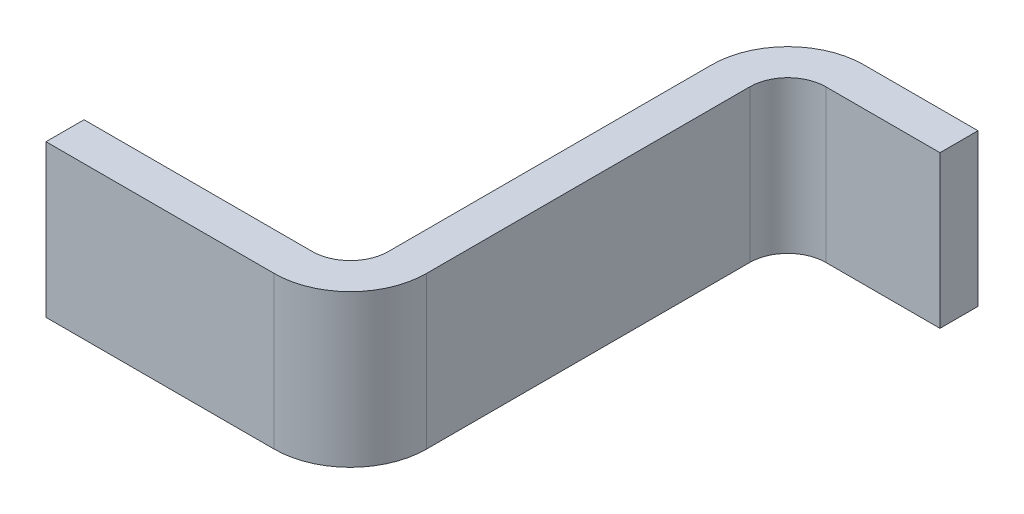
ISO-10303-21;
HEADER;
FILE_DESCRIPTION(('STEP AP214'),'2;1');
FILE_NAME('part.step','',(''),(''),'','','');
FILE_SCHEMA(('AUTOMOTIVE_DESIGN { 1 0 10303 214 1 1 1 1 }'));
ENDSEC;
DATA;
#1=APPLICATION_CONTEXT('core data for automotive mechanical design processes');
#2=APPLICATION_PROTOCOL_DEFINITION('international standard','automotive_design',2000,#1);
#3=PRODUCT_CONTEXT('',#1,'mechanical');
#4=PRODUCT('Part','Part','',(#3));
#5=PRODUCT_RELATED_PRODUCT_CATEGORY('part','',(#4));
#6=PRODUCT_DEFINITION_FORMATION('','',#4);
#7=PRODUCT_DEFINITION_CONTEXT('part definition',#1,'design');
#8=PRODUCT_DEFINITION('design','',#6,#7);
#9=PRODUCT_DEFINITION_SHAPE('','',#8);
#10=(LENGTH_UNIT() NAMED_UNIT(*) SI_UNIT(.MILLI.,.METRE.));
#11=(NAMED_UNIT(*) PLANE_ANGLE_UNIT() SI_UNIT($,.RADIAN.));
#12=(NAMED_UNIT(*) SI_UNIT($,.STERADIAN.) SOLID_ANGLE_UNIT());
#13=UNCERTAINTY_MEASURE_WITH_UNIT(LENGTH_MEASURE(1.E-05),#10,'distance_accuracy_value','');
#14=(GEOMETRIC_REPRESENTATION_CONTEXT(3) GLOBAL_UNCERTAINTY_ASSIGNED_CONTEXT((#13)) GLOBAL_UNIT_ASSIGNED_CONTEXT((#10,
#11,#12)) REPRESENTATION_CONTEXT('',''));
#15=CARTESIAN_POINT('',(0.,0.,0.));
#16=DIRECTION('',(0.,0.,1.));
#17=DIRECTION('',(1.,0.,0.));
#18=AXIS2_PLACEMENT_3D('',#15,#16,#17);
#19=CARTESIAN_POINT('',(0.,0.2,1.25));
#20=DIRECTION('',(0.,0.,-1.));
#21=DIRECTION('',(-1.,0.,0.));
#22=AXIS2_PLACEMENT_3D('',#19,#20,#21);
#23=PLANE('',#22);
#24=DIRECTION('',(1.,0.,0.));
#25=VECTOR('',#24,1.);
#26=CARTESIAN_POINT('',(0.,0.2,1.25));
#27=LINE('',#26,#25);
#28=CARTESIAN_POINT('',(0.6,0.2,1.25));
#29=VERTEX_POINT('',#28);
#30=CARTESIAN_POINT('',(0.,0.2,1.25));
#31=VERTEX_POINT('',#30);
#32=EDGE_CURVE('E83',#29,#31,#27,.F.);
#33=ORIENTED_EDGE('',*,*,#32,.T.);
#34=DIRECTION('',(0.,1.,0.));
#35=VECTOR('',#34,1.);
#36=CARTESIAN_POINT('',(0.,-0.2,1.25));
#37=LINE('',#36,#35);
#38=CARTESIAN_POINT('',(0.,-0.2,1.25));
#39=VERTEX_POINT('',#38);
#40=EDGE_CURVE('E109',#39,#31,#37,.T.);
#41=ORIENTED_EDGE('',*,*,#40,.F.);
#42=DIRECTION('',(1.,0.,0.));
#43=VECTOR('',#42,1.);
#44=CARTESIAN_POINT('',(0.,-0.2,1.25));
#45=LINE('',#44,#43);
#46=CARTESIAN_POINT('',(0.6,-0.2,1.25));
#47=VERTEX_POINT('',#46);
#48=EDGE_CURVE('E128',#39,#47,#45,.T.);
#49=ORIENTED_EDGE('',*,*,#48,.T.);
#50=DIRECTION('',(0.,1.,0.));
#51=VECTOR('',#50,1.);
#52=CARTESIAN_POINT('',(0.6,0.2,1.25));
#53=LINE('',#52,#51);
#54=EDGE_CURVE('E119',#29,#47,#53,.F.);
#55=ORIENTED_EDGE('',*,*,#54,.F.);
#56=EDGE_LOOP('',(#33,#41,#49,#55));
#57=FACE_BOUND('',#56,.T.);
#58=ADVANCED_FACE('F15',(#57),#23,.F.);
#59=CARTESIAN_POINT('',(0.9,0.2,0.1));
#60=DIRECTION('',(0.,0.,-1.));
#61=DIRECTION('',(-1.,0.,0.));
#62=AXIS2_PLACEMENT_3D('',#59,#60,#61);
#63=PLANE('',#62);
#64=DIRECTION('',(1.,0.,0.));
#65=VECTOR('',#64,1.);
#66=CARTESIAN_POINT('',(0.9,0.2,0.1));
#67=LINE('',#66,#65);
#68=CARTESIAN_POINT('',(1.2,0.2,0.1));
#69=VERTEX_POINT('',#68);
#70=CARTESIAN_POINT('',(0.9,0.2,0.1));
#71=VERTEX_POINT('',#70);
#72=EDGE_CURVE('E140',#69,#71,#67,.F.);
#73=ORIENTED_EDGE('',*,*,#72,.T.);
#74=DIRECTION('',(0.,-1.,0.));
#75=VECTOR('',#74,1.);
#76=CARTESIAN_POINT('',(0.9,0.2,0.1));
#77=LINE('',#76,#75);
#78=CARTESIAN_POINT('',(0.9,-0.2,0.1));
#79=VERTEX_POINT('',#78);
#80=EDGE_CURVE('E187',#71,#79,#77,.T.);
#81=ORIENTED_EDGE('',*,*,#80,.T.);
#82=DIRECTION('',(1.,0.,0.));
#83=VECTOR('',#82,1.);
#84=CARTESIAN_POINT('',(0.9,-0.2,0.1));
#85=LINE('',#84,#83);
#86=CARTESIAN_POINT('',(1.2,-0.2,0.1));
#87=VERTEX_POINT('',#86);
#88=EDGE_CURVE('E191',#79,#87,#85,.T.);
#89=ORIENTED_EDGE('',*,*,#88,.T.);
#90=DIRECTION('',(0.,1.,0.));
#91=VECTOR('',#90,1.);
#92=CARTESIAN_POINT('',(1.2,-0.2,0.1));
#93=LINE('',#92,#91);
#94=EDGE_CURVE('E94',#87,#69,#93,.T.);
#95=ORIENTED_EDGE('',*,*,#94,.T.);
#96=EDGE_LOOP('',(#73,#81,#89,#95));
#97=FACE_BOUND('',#96,.T.);
#98=ADVANCED_FACE('F228',(#97),#63,.F.);
#99=CARTESIAN_POINT('',(0.,-0.2,1.15));
#100=DIRECTION('',(-1.,0.,0.));
#101=DIRECTION('',(0.,0.,1.));
#102=AXIS2_PLACEMENT_3D('',#99,#100,#101);
#103=PLANE('',#102);
#104=DIRECTION('',(0.,0.,1.));
#105=VECTOR('',#104,1.);
#106=CARTESIAN_POINT('',(0.,0.2,1.15));
#107=LINE('',#106,#105);
#108=CARTESIAN_POINT('',(0.,0.2,1.15));
#109=VERTEX_POINT('',#108);
#110=EDGE_CURVE('E112',#31,#109,#107,.F.);
#111=ORIENTED_EDGE('',*,*,#110,.T.);
#112=DIRECTION('',(0.,1.,0.));
#113=VECTOR('',#112,1.);
#114=CARTESIAN_POINT('',(0.,-0.2,1.15));
#115=LINE('',#114,#113);
#116=CARTESIAN_POINT('',(0.,-0.2,1.15));
#117=VERTEX_POINT('',#116);
#118=EDGE_CURVE('E173',#109,#117,#115,.F.);
#119=ORIENTED_EDGE('',*,*,#118,.T.);
#120=DIRECTION('',(0.,0.,1.));
#121=VECTOR('',#120,1.);
#122=CARTESIAN_POINT('',(0.,-0.2,1.25));
#123=LINE('',#122,#121);
#124=EDGE_CURVE('E114',#117,#39,#123,.T.);
#125=ORIENTED_EDGE('',*,*,#124,.T.);
#126=ORIENTED_EDGE('',*,*,#40,.T.);
#127=EDGE_LOOP('',(#111,#119,#125,#126));
#128=FACE_BOUND('',#127,.T.);
#129=ADVANCED_FACE('F110',(#128),#103,.T.);
#130=CARTESIAN_POINT('',(0.6,0.2,1.05));
#131=DIRECTION('',(0.,1.,0.));
#132=DIRECTION('',(0.,0.,1.));
#133=AXIS2_PLACEMENT_3D('',#130,#131,#132);
#134=CYLINDRICAL_SURFACE('',#133,0.2);
#135=CARTESIAN_POINT('',(0.6,0.2,1.05));
#136=DIRECTION('',(0.,1.,0.));
#137=DIRECTION('',(0.,0.,1.));
#138=AXIS2_PLACEMENT_3D('',#135,#136,#137);
#139=CIRCLE('',#138,0.2);
#140=CARTESIAN_POINT('',(0.8,0.2,1.05));
#141=VERTEX_POINT('',#140);
#142=EDGE_CURVE('E18',#29,#141,#139,.T.);
#143=ORIENTED_EDGE('',*,*,#142,.F.);
#144=ORIENTED_EDGE('',*,*,#54,.T.);
#145=CARTESIAN_POINT('',(0.6,-0.2,1.05));
#146=DIRECTION('',(0.,1.,0.));
#147=DIRECTION('',(0.,0.,1.));
#148=AXIS2_PLACEMENT_3D('',#145,#146,#147);
#149=CIRCLE('',#148,0.2);
#150=CARTESIAN_POINT('',(0.8,-0.2,1.05));
#151=VERTEX_POINT('',#150);
#152=EDGE_CURVE('E164',#151,#47,#149,.F.);
#153=ORIENTED_EDGE('',*,*,#152,.F.);
#154=DIRECTION('',(0.,1.,0.));
#155=VECTOR('',#154,1.);
#156=CARTESIAN_POINT('',(0.8,0.2,1.05));
#157=LINE('',#156,#155);
#158=EDGE_CURVE('E166',#151,#141,#157,.T.);
#159=ORIENTED_EDGE('',*,*,#158,.T.);
#160=EDGE_LOOP('',(#143,#144,#153,#159));
#161=FACE_BOUND('',#160,.T.);
#162=ADVANCED_FACE('F218',(#161),#134,.T.);
#163=CARTESIAN_POINT('',(1.2,-0.2,0.));
#164=DIRECTION('',(-1.,0.,0.));
#165=DIRECTION('',(0.,0.,1.));
#166=AXIS2_PLACEMENT_3D('',#163,#164,#165);
#167=PLANE('',#166);
#168=DIRECTION('',(0.,0.,1.));
#169=VECTOR('',#168,1.);
#170=CARTESIAN_POINT('',(1.2,0.2,0.));
#171=LINE('',#170,#169);
#172=CARTESIAN_POINT('',(1.2,0.2,0.));
#173=VERTEX_POINT('',#172);
#174=EDGE_CURVE('E139',#69,#173,#171,.F.);
#175=ORIENTED_EDGE('',*,*,#174,.F.);
#176=ORIENTED_EDGE('',*,*,#94,.F.);
#177=DIRECTION('',(0.,0.,1.));
#178=VECTOR('',#177,1.);
#179=CARTESIAN_POINT('',(1.2,-0.2,0.1));
#180=LINE('',#179,#178);
#181=CARTESIAN_POINT('',(1.2,-0.2,0.));
#182=VERTEX_POINT('',#181);
#183=EDGE_CURVE('E190',#87,#182,#180,.F.);
#184=ORIENTED_EDGE('',*,*,#183,.T.);
#185=DIRECTION('',(0.,1.,0.));
#186=VECTOR('',#185,1.);
#187=CARTESIAN_POINT('',(1.2,-0.2,0.));
#188=LINE('',#187,#186);
#189=EDGE_CURVE('E159',#182,#173,#188,.T.);
#190=ORIENTED_EDGE('',*,*,#189,.T.);
#191=EDGE_LOOP('',(#175,#176,#184,#190));
#192=FACE_BOUND('',#191,.T.);
#193=ADVANCED_FACE('F230',(#192),#167,.F.);
#194=CARTESIAN_POINT('',(0.9,0.2,0.2));
#195=DIRECTION('',(0.,-1.,0.));
#196=DIRECTION('',(0.,0.,-1.));
#197=AXIS2_PLACEMENT_3D('',#194,#195,#196);
#198=CYLINDRICAL_SURFACE('',#197,0.1);
#199=CARTESIAN_POINT('',(0.9,0.2,0.2));
#200=DIRECTION('',(0.,-1.,0.));
#201=DIRECTION('',(0.,0.,-1.));
#202=AXIS2_PLACEMENT_3D('',#199,#200,#201);
#203=CIRCLE('',#202,0.1);
#204=CARTESIAN_POINT('',(0.8,0.2,0.2));
#205=VERTEX_POINT('',#204);
#206=EDGE_CURVE('E160',#205,#71,#203,.T.);
#207=ORIENTED_EDGE('',*,*,#206,.F.);
#208=DIRECTION('',(0.,1.,0.));
#209=VECTOR('',#208,1.);
#210=CARTESIAN_POINT('',(0.8,0.2,0.2));
#211=LINE('',#210,#209);
#212=CARTESIAN_POINT('',(0.8,-0.2,0.2));
#213=VERTEX_POINT('',#212);
#214=EDGE_CURVE('E163',#205,#213,#211,.F.);
#215=ORIENTED_EDGE('',*,*,#214,.T.);
#216=CARTESIAN_POINT('',(0.9,-0.2,0.2));
#217=DIRECTION('',(0.,-1.,0.));
#218=DIRECTION('',(0.,0.,-1.));
#219=AXIS2_PLACEMENT_3D('',#216,#217,#218);
#220=CIRCLE('',#219,0.1);
#221=EDGE_CURVE('E157',#79,#213,#220,.F.);
#222=ORIENTED_EDGE('',*,*,#221,.F.);
#223=ORIENTED_EDGE('',*,*,#80,.F.);
#224=EDGE_LOOP('',(#207,#215,#222,#223));
#225=FACE_BOUND('',#224,.T.);
#226=ADVANCED_FACE('F224',(#225),#198,.F.);
#227=CARTESIAN_POINT('',(0.,-0.2,1.15));
#228=DIRECTION('',(0.,0.,1.));
#229=DIRECTION('',(1.,0.,0.));
#230=AXIS2_PLACEMENT_3D('',#227,#228,#229);
#231=PLANE('',#230);
#232=DIRECTION('',(1.,0.,0.));
#233=VECTOR('',#232,1.);
#234=CARTESIAN_POINT('',(0.,-0.2,1.15));
#235=LINE('',#234,#233);
#236=CARTESIAN_POINT('',(0.6,-0.2,1.15));
#237=VERTEX_POINT('',#236);
#238=EDGE_CURVE('E167',#117,#237,#235,.T.);
#239=ORIENTED_EDGE('',*,*,#238,.F.);
#240=ORIENTED_EDGE('',*,*,#118,.F.);
#241=DIRECTION('',(1.,0.,0.));
#242=VECTOR('',#241,1.);
#243=CARTESIAN_POINT('',(0.,0.2,1.15));
#244=LINE('',#243,#242);
#245=CARTESIAN_POINT('',(0.6,0.2,1.15));
#246=VERTEX_POINT('',#245);
#247=EDGE_CURVE('E126',#246,#109,#244,.F.);
#248=ORIENTED_EDGE('',*,*,#247,.F.);
#249=DIRECTION('',(0.,1.,0.));
#250=VECTOR('',#249,1.);
#251=CARTESIAN_POINT('',(0.6,-0.2,1.15));
#252=LINE('',#251,#250);
#253=EDGE_CURVE('E153',#246,#237,#252,.F.);
#254=ORIENTED_EDGE('',*,*,#253,.T.);
#255=EDGE_LOOP('',(#239,#240,#248,#254));
#256=FACE_BOUND('',#255,.T.);
#257=ADVANCED_FACE('F264',(#256),#231,.F.);
#258=CARTESIAN_POINT('',(0.8,0.2,1.05));
#259=DIRECTION('',(-1.,0.,0.));
#260=DIRECTION('',(0.,0.,1.));
#261=AXIS2_PLACEMENT_3D('',#258,#259,#260);
#262=PLANE('',#261);
#263=DIRECTION('',(0.,0.,-1.));
#264=VECTOR('',#263,1.);
#265=CARTESIAN_POINT('',(0.8,0.2,1.05));
#266=LINE('',#265,#264);
#267=EDGE_CURVE('E156',#205,#141,#266,.F.);
#268=ORIENTED_EDGE('',*,*,#267,.T.);
#269=ORIENTED_EDGE('',*,*,#158,.F.);
#270=DIRECTION('',(0.,0.,1.));
#271=VECTOR('',#270,1.);
#272=CARTESIAN_POINT('',(0.8,-0.2,1.05));
#273=LINE('',#272,#271);
#274=EDGE_CURVE('E150',#151,#213,#273,.F.);
#275=ORIENTED_EDGE('',*,*,#274,.T.);
#276=ORIENTED_EDGE('',*,*,#214,.F.);
#277=EDGE_LOOP('',(#268,#269,#275,#276));
#278=FACE_BOUND('',#277,.T.);
#279=ADVANCED_FACE('F266',(#278),#262,.F.);
#280=CARTESIAN_POINT('',(0.9,-0.2,0.));
#281=DIRECTION('',(0.,0.,1.));
#282=DIRECTION('',(1.,0.,0.));
#283=AXIS2_PLACEMENT_3D('',#280,#281,#282);
#284=PLANE('',#283);
#285=DIRECTION('',(1.,0.,0.));
#286=VECTOR('',#285,1.);
#287=CARTESIAN_POINT('',(0.9,-0.2,0.));
#288=LINE('',#287,#286);
#289=CARTESIAN_POINT('',(0.9,-0.2,0.));
#290=VERTEX_POINT('',#289);
#291=EDGE_CURVE('E201',#290,#182,#288,.T.);
#292=ORIENTED_EDGE('',*,*,#291,.F.);
#293=DIRECTION('',(0.,-1.,0.));
#294=VECTOR('',#293,1.);
#295=CARTESIAN_POINT('',(0.9,-0.2,0.));
#296=LINE('',#295,#294);
#297=CARTESIAN_POINT('',(0.9,0.2,0.));
#298=VERTEX_POINT('',#297);
#299=EDGE_CURVE('E147',#298,#290,#296,.T.);
#300=ORIENTED_EDGE('',*,*,#299,.F.);
#301=DIRECTION('',(1.,0.,0.));
#302=VECTOR('',#301,1.);
#303=CARTESIAN_POINT('',(0.9,0.2,0.));
#304=LINE('',#303,#302);
#305=EDGE_CURVE('E162',#173,#298,#304,.F.);
#306=ORIENTED_EDGE('',*,*,#305,.F.);
#307=ORIENTED_EDGE('',*,*,#189,.F.);
#308=EDGE_LOOP('',(#292,#300,#306,#307));
#309=FACE_BOUND('',#308,.T.);
#310=ADVANCED_FACE('F236',(#309),#284,.F.);
#311=CARTESIAN_POINT('',(0.7,0.2,1.05));
#312=DIRECTION('',(0.,-1.,0.));
#313=DIRECTION('',(0.,0.,-1.));
#314=AXIS2_PLACEMENT_3D('',#311,#312,#313);
#315=PLANE('',#314);
#316=DIRECTION('',(0.,0.,-1.));
#317=VECTOR('',#316,1.);
#318=CARTESIAN_POINT('',(0.7,0.2,1.05));
#319=LINE('',#318,#317);
#320=CARTESIAN_POINT('',(0.7,0.2,0.2));
#321=VERTEX_POINT('',#320);
#322=CARTESIAN_POINT('',(0.7,0.2,1.05));
#323=VERTEX_POINT('',#322);
#324=EDGE_CURVE('E146',#321,#323,#319,.F.);
#325=ORIENTED_EDGE('',*,*,#324,.T.);
#326=CARTESIAN_POINT('',(0.6,0.2,1.05));
#327=DIRECTION('',(0.,1.,0.));
#328=DIRECTION('',(0.,0.,1.));
#329=AXIS2_PLACEMENT_3D('',#326,#327,#328);
#330=CIRCLE('',#329,0.1);
#331=EDGE_CURVE('E154',#323,#246,#330,.F.);
#332=ORIENTED_EDGE('',*,*,#331,.T.);
#333=ORIENTED_EDGE('',*,*,#247,.T.);
#334=ORIENTED_EDGE('',*,*,#110,.F.);
#335=ORIENTED_EDGE('',*,*,#32,.F.);
#336=ORIENTED_EDGE('',*,*,#142,.T.);
#337=ORIENTED_EDGE('',*,*,#267,.F.);
#338=ORIENTED_EDGE('',*,*,#206,.T.);
#339=ORIENTED_EDGE('',*,*,#72,.F.);
#340=ORIENTED_EDGE('',*,*,#174,.T.);
#341=ORIENTED_EDGE('',*,*,#305,.T.);
#342=CARTESIAN_POINT('',(0.9,0.2,0.2));
#343=DIRECTION('',(0.,-1.,0.));
#344=DIRECTION('',(0.,0.,-1.));
#345=AXIS2_PLACEMENT_3D('',#342,#343,#344);
#346=CIRCLE('',#345,0.2);
#347=EDGE_CURVE('E148',#321,#298,#346,.T.);
#348=ORIENTED_EDGE('',*,*,#347,.F.);
#349=EDGE_LOOP('',(#325,#332,#333,#334,#335,#336,#337,#338,#339,#340,#341,#348));
#350=FACE_BOUND('',#349,.T.);
#351=ADVANCED_FACE('F124',(#350),#315,.F.);
#352=CARTESIAN_POINT('',(0.6,-0.2,1.05));
#353=DIRECTION('',(0.,1.,0.));
#354=DIRECTION('',(0.,0.,1.));
#355=AXIS2_PLACEMENT_3D('',#352,#353,#354);
#356=CYLINDRICAL_SURFACE('',#355,0.1);
#357=CARTESIAN_POINT('',(0.6,-0.2,1.05));
#358=DIRECTION('',(0.,1.,0.));
#359=DIRECTION('',(0.,0.,1.));
#360=AXIS2_PLACEMENT_3D('',#357,#358,#359);
#361=CIRCLE('',#360,0.1);
#362=CARTESIAN_POINT('',(0.7,-0.2,1.05));
#363=VERTEX_POINT('',#362);
#364=EDGE_CURVE('E151',#237,#363,#361,.T.);
#365=ORIENTED_EDGE('',*,*,#364,.F.);
#366=ORIENTED_EDGE('',*,*,#253,.F.);
#367=ORIENTED_EDGE('',*,*,#331,.F.);
#368=DIRECTION('',(0.,1.,0.));
#369=VECTOR('',#368,1.);
#370=CARTESIAN_POINT('',(0.7,-0.2,1.05));
#371=LINE('',#370,#369);
#372=EDGE_CURVE('E249',#323,#363,#371,.F.);
#373=ORIENTED_EDGE('',*,*,#372,.T.);
#374=EDGE_LOOP('',(#365,#366,#367,#373));
#375=FACE_BOUND('',#374,.T.);
#376=ADVANCED_FACE('F261',(#375),#356,.F.);
#377=CARTESIAN_POINT('',(0.8,-0.2,1.05));
#378=DIRECTION('',(0.,1.,0.));
#379=DIRECTION('',(0.,0.,1.));
#380=AXIS2_PLACEMENT_3D('',#377,#378,#379);
#381=PLANE('',#380);
#382=ORIENTED_EDGE('',*,*,#274,.F.);
#383=ORIENTED_EDGE('',*,*,#152,.T.);
#384=ORIENTED_EDGE('',*,*,#48,.F.);
#385=ORIENTED_EDGE('',*,*,#124,.F.);
#386=ORIENTED_EDGE('',*,*,#238,.T.);
#387=ORIENTED_EDGE('',*,*,#364,.T.);
#388=DIRECTION('',(0.,0.,-1.));
#389=VECTOR('',#388,1.);
#390=CARTESIAN_POINT('',(0.7,-0.2,1.05));
#391=LINE('',#390,#389);
#392=CARTESIAN_POINT('',(0.7,-0.2,0.2));
#393=VERTEX_POINT('',#392);
#394=EDGE_CURVE('E24',#363,#393,#391,.T.);
#395=ORIENTED_EDGE('',*,*,#394,.T.);
#396=CARTESIAN_POINT('',(0.9,-0.2,0.2));
#397=DIRECTION('',(0.,-1.,0.));
#398=DIRECTION('',(0.,0.,-1.));
#399=AXIS2_PLACEMENT_3D('',#396,#397,#398);
#400=CIRCLE('',#399,0.2);
#401=EDGE_CURVE('E32',#290,#393,#400,.F.);
#402=ORIENTED_EDGE('',*,*,#401,.F.);
#403=ORIENTED_EDGE('',*,*,#291,.T.);
#404=ORIENTED_EDGE('',*,*,#183,.F.);
#405=ORIENTED_EDGE('',*,*,#88,.F.);
#406=ORIENTED_EDGE('',*,*,#221,.T.);
#407=EDGE_LOOP('',(#382,#383,#384,#385,#386,#387,#395,#402,#403,#404,#405,#406));
#408=FACE_BOUND('',#407,.T.);
#409=ADVANCED_FACE('F238',(#408),#381,.F.);
#410=CARTESIAN_POINT('',(0.9,-0.2,0.2));
#411=DIRECTION('',(0.,-1.,0.));
#412=DIRECTION('',(0.,0.,-1.));
#413=AXIS2_PLACEMENT_3D('',#410,#411,#412);
#414=CYLINDRICAL_SURFACE('',#413,0.2);
#415=ORIENTED_EDGE('',*,*,#401,.T.);
#416=DIRECTION('',(0.,1.,0.));
#417=VECTOR('',#416,1.);
#418=CARTESIAN_POINT('',(0.7,-0.2,0.2));
#419=LINE('',#418,#417);
#420=EDGE_CURVE('E10',#393,#321,#419,.T.);
#421=ORIENTED_EDGE('',*,*,#420,.T.);
#422=ORIENTED_EDGE('',*,*,#347,.T.);
#423=ORIENTED_EDGE('',*,*,#299,.T.);
#424=EDGE_LOOP('',(#415,#421,#422,#423));
#425=FACE_BOUND('',#424,.T.);
#426=ADVANCED_FACE('F258',(#425),#414,.T.);
#427=CARTESIAN_POINT('',(0.7,-0.2,1.05));
#428=DIRECTION('',(1.,0.,0.));
#429=DIRECTION('',(0.,0.,-1.));
#430=AXIS2_PLACEMENT_3D('',#427,#428,#429);
#431=PLANE('',#430);
#432=ORIENTED_EDGE('',*,*,#394,.F.);
#433=ORIENTED_EDGE('',*,*,#372,.F.);
#434=ORIENTED_EDGE('',*,*,#324,.F.);
#435=ORIENTED_EDGE('',*,*,#420,.F.);
#436=EDGE_LOOP('',(#432,#433,#434,#435));
#437=FACE_BOUND('',#436,.T.);
#438=ADVANCED_FACE('F256',(#437),#431,.F.);
#439=CLOSED_SHELL('',(#58,#98,#129,#162,#193,#226,#257,#279,#310,#351,#376,#409,#426,#438));
#440=MANIFOLD_SOLID_BREP('B1',#439);
#441=ADVANCED_BREP_SHAPE_REPRESENTATION('',(#18,#440),#14);
#442=SHAPE_DEFINITION_REPRESENTATION(#9,#441);
ENDSEC;
END-ISO-10303-21;
